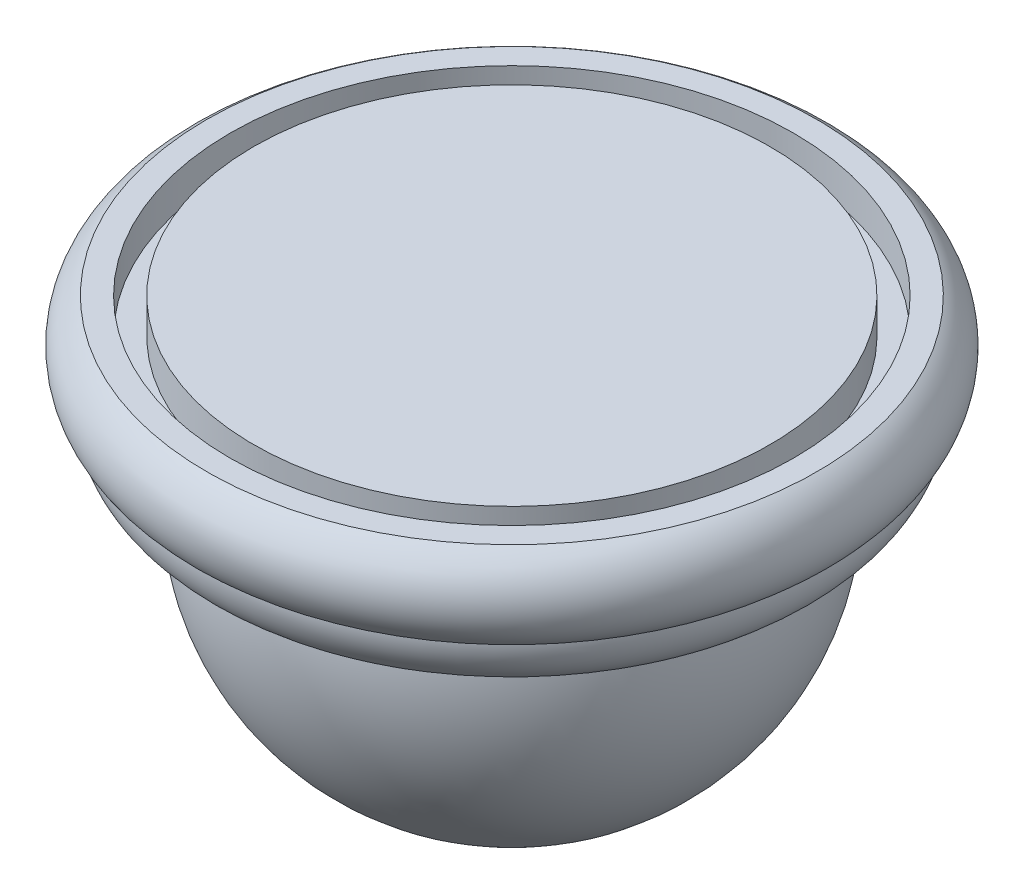
ISO-10303-21;
HEADER;
FILE_DESCRIPTION(('STEP AP214'),'2;1');
FILE_NAME('part.step','',(''),(''),'','','');
FILE_SCHEMA(('AUTOMOTIVE_DESIGN { 1 0 10303 214 1 1 1 1 }'));
ENDSEC;
DATA;
#1=APPLICATION_CONTEXT('core data for automotive mechanical design processes');
#2=APPLICATION_PROTOCOL_DEFINITION('international standard','automotive_design',2000,#1);
#3=PRODUCT_CONTEXT('',#1,'mechanical');
#4=PRODUCT('Part','Part','',(#3));
#5=PRODUCT_RELATED_PRODUCT_CATEGORY('part','',(#4));
#6=PRODUCT_DEFINITION_FORMATION('','',#4);
#7=PRODUCT_DEFINITION_CONTEXT('part definition',#1,'design');
#8=PRODUCT_DEFINITION('design','',#6,#7);
#9=PRODUCT_DEFINITION_SHAPE('','',#8);
#10=(LENGTH_UNIT() NAMED_UNIT(*) SI_UNIT(.MILLI.,.METRE.));
#11=(NAMED_UNIT(*) PLANE_ANGLE_UNIT() SI_UNIT($,.RADIAN.));
#12=(NAMED_UNIT(*) SI_UNIT($,.STERADIAN.) SOLID_ANGLE_UNIT());
#13=UNCERTAINTY_MEASURE_WITH_UNIT(LENGTH_MEASURE(1.E-05),#10,'distance_accuracy_value','');
#14=(GEOMETRIC_REPRESENTATION_CONTEXT(3) GLOBAL_UNCERTAINTY_ASSIGNED_CONTEXT((#13)) GLOBAL_UNIT_ASSIGNED_CONTEXT((#10,
#11,#12)) REPRESENTATION_CONTEXT('',''));
#15=CARTESIAN_POINT('',(0.,0.,0.));
#16=DIRECTION('',(0.,0.,1.));
#17=DIRECTION('',(1.,0.,0.));
#18=AXIS2_PLACEMENT_3D('',#15,#16,#17);
#19=CARTESIAN_POINT('',(0.,-10.8932151769971,0.));
#20=DIRECTION('',(0.,1.,0.));
#21=DIRECTION('',(1.,0.,0.));
#22=AXIS2_PLACEMENT_3D('',#19,#20,#21);
#23=SPHERICAL_SURFACE('',#22,33.5567848230029);
#24=CARTESIAN_POINT('',(0.,-5.19400686490966,0.));
#25=DIRECTION('',(0.,1.,0.));
#26=DIRECTION('',(-1.,0.,0.));
#27=AXIS2_PLACEMENT_3D('',#24,#25,#26);
#28=CIRCLE('',#27,33.0692732347228);
#29=CARTESIAN_POINT('',(-33.0692732347228,-5.19400686490966,0.));
#30=VERTEX_POINT('',#29);
#31=EDGE_CURVE('E10',#30,#30,#28,.T.);
#32=ORIENTED_EDGE('',*,*,#31,.F.);
#33=EDGE_LOOP('',(#32));
#34=FACE_BOUND('',#33,.T.);
#35=ADVANCED_FACE('F41',(#34),#23,.T.);
#36=CARTESIAN_POINT('',(0.,1.27512222572111,0.));
#37=DIRECTION('',(0.,1.,0.));
#38=DIRECTION('',(-1.,0.,0.));
#39=AXIS2_PLACEMENT_3D('',#36,#37,#38);
#40=TOROIDAL_SURFACE('',#39,35.222476461101,6.81805803182481);
#41=CARTESIAN_POINT('',(0.,1.52253499013513,0.));
#42=DIRECTION('',(0.,1.,0.));
#43=DIRECTION('',(-1.,0.,0.));
#44=AXIS2_PLACEMENT_3D('',#41,#42,#43);
#45=CIRCLE('',#44,42.0360439737434);
#46=CARTESIAN_POINT('',(-42.0360439737434,1.52253499013512,0.));
#47=VERTEX_POINT('',#46);
#48=EDGE_CURVE('E48',#47,#47,#45,.T.);
#49=ORIENTED_EDGE('',*,*,#48,.F.);
#50=EDGE_LOOP('',(#49));
#51=FACE_BOUND('',#50,.T.);
#52=ORIENTED_EDGE('',*,*,#31,.T.);
#53=EDGE_LOOP('',(#52));
#54=FACE_BOUND('',#53,.T.);
#55=ADVANCED_FACE('F105',(#51,#54),#40,.T.);
#56=CARTESIAN_POINT('',(0.,6.84723711812244,0.));
#57=DIRECTION('',(0.,1.,0.));
#58=DIRECTION('',(-1.,0.,0.));
#59=AXIS2_PLACEMENT_3D('',#56,#57,#58);
#60=TOROIDAL_SURFACE('',#59,37.7777036193872,6.81805803182482);
#61=CARTESIAN_POINT('',(0.,12.7,0.));
#62=DIRECTION('',(0.,1.,0.));
#63=DIRECTION('',(-1.,0.,0.));
#64=AXIS2_PLACEMENT_3D('',#61,#62,#63);
#65=CIRCLE('',#64,41.275);
#66=CARTESIAN_POINT('',(-41.275,12.7,0.));
#67=VERTEX_POINT('',#66);
#68=EDGE_CURVE('E53',#67,#67,#65,.T.);
#69=ORIENTED_EDGE('',*,*,#68,.F.);
#70=EDGE_LOOP('',(#69));
#71=FACE_BOUND('',#70,.T.);
#72=ORIENTED_EDGE('',*,*,#48,.T.);
#73=EDGE_LOOP('',(#72));
#74=FACE_BOUND('',#73,.T.);
#75=ADVANCED_FACE('F100',(#71,#74),#60,.T.);
#76=CARTESIAN_POINT('',(38.1,12.7,0.));
#77=DIRECTION('',(0.,-1.,0.));
#78=DIRECTION('',(1.,0.,0.));
#79=AXIS2_PLACEMENT_3D('',#76,#77,#78);
#80=PLANE('',#79);
#81=CARTESIAN_POINT('',(0.,12.7,0.));
#82=DIRECTION('',(0.,1.,0.));
#83=DIRECTION('',(-1.,0.,0.));
#84=AXIS2_PLACEMENT_3D('',#81,#82,#83);
#85=CIRCLE('',#84,38.1);
#86=CARTESIAN_POINT('',(-38.1,12.7,0.));
#87=VERTEX_POINT('',#86);
#88=EDGE_CURVE('E58',#87,#87,#85,.T.);
#89=ORIENTED_EDGE('',*,*,#88,.F.);
#90=EDGE_LOOP('',(#89));
#91=FACE_BOUND('',#90,.T.);
#92=ORIENTED_EDGE('',*,*,#68,.T.);
#93=EDGE_LOOP('',(#92));
#94=FACE_BOUND('',#93,.T.);
#95=ADVANCED_FACE('F94',(#91,#94),#80,.F.);
#96=CARTESIAN_POINT('',(0.,12.7,0.));
#97=DIRECTION('',(0.,1.,0.));
#98=DIRECTION('',(-1.,0.,0.));
#99=AXIS2_PLACEMENT_3D('',#96,#97,#98);
#100=CYLINDRICAL_SURFACE('',#99,38.1);
#101=CARTESIAN_POINT('',(0.,7.9375,0.));
#102=DIRECTION('',(0.,1.,0.));
#103=DIRECTION('',(-1.,0.,0.));
#104=AXIS2_PLACEMENT_3D('',#101,#102,#103);
#105=CIRCLE('',#104,38.1);
#106=CARTESIAN_POINT('',(-38.1,7.93749999999999,0.));
#107=VERTEX_POINT('',#106);
#108=EDGE_CURVE('E64',#107,#107,#105,.T.);
#109=ORIENTED_EDGE('',*,*,#108,.F.);
#110=EDGE_LOOP('',(#109));
#111=FACE_BOUND('',#110,.T.);
#112=ORIENTED_EDGE('',*,*,#88,.T.);
#113=EDGE_LOOP('',(#112));
#114=FACE_BOUND('',#113,.T.);
#115=ADVANCED_FACE('F88',(#111,#114),#100,.F.);
#116=CARTESIAN_POINT('',(38.1,7.9375,0.));
#117=DIRECTION('',(0.,-1.,0.));
#118=DIRECTION('',(1.,0.,0.));
#119=AXIS2_PLACEMENT_3D('',#116,#117,#118);
#120=PLANE('',#119);
#121=CARTESIAN_POINT('',(0.,7.9375,0.));
#122=DIRECTION('',(0.,1.,0.));
#123=DIRECTION('',(-1.,0.,0.));
#124=AXIS2_PLACEMENT_3D('',#121,#122,#123);
#125=CIRCLE('',#124,34.925);
#126=CARTESIAN_POINT('',(-34.925,7.93749999999999,0.));
#127=VERTEX_POINT('',#126);
#128=EDGE_CURVE('E68',#127,#127,#125,.T.);
#129=ORIENTED_EDGE('',*,*,#128,.F.);
#130=EDGE_LOOP('',(#129));
#131=FACE_BOUND('',#130,.T.);
#132=ORIENTED_EDGE('',*,*,#108,.T.);
#133=EDGE_LOOP('',(#132));
#134=FACE_BOUND('',#133,.T.);
#135=ADVANCED_FACE('F82',(#131,#134),#120,.F.);
#136=CARTESIAN_POINT('',(0.,12.7,0.));
#137=DIRECTION('',(0.,1.,0.));
#138=DIRECTION('',(-1.,0.,0.));
#139=AXIS2_PLACEMENT_3D('',#136,#137,#138);
#140=CYLINDRICAL_SURFACE('',#139,34.925);
#141=CARTESIAN_POINT('',(0.,12.7,0.));
#142=DIRECTION('',(0.,1.,0.));
#143=DIRECTION('',(-1.,0.,0.));
#144=AXIS2_PLACEMENT_3D('',#141,#142,#143);
#145=CIRCLE('',#144,34.925);
#146=CARTESIAN_POINT('',(-34.925,12.7,0.));
#147=VERTEX_POINT('',#146);
#148=EDGE_CURVE('E72',#147,#147,#145,.T.);
#149=ORIENTED_EDGE('',*,*,#148,.F.);
#150=EDGE_LOOP('',(#149));
#151=FACE_BOUND('',#150,.T.);
#152=ORIENTED_EDGE('',*,*,#128,.T.);
#153=EDGE_LOOP('',(#152));
#154=FACE_BOUND('',#153,.T.);
#155=ADVANCED_FACE('F79',(#151,#154),#140,.T.);
#156=CARTESIAN_POINT('',(34.925,12.7,0.));
#157=DIRECTION('',(0.,-1.,0.));
#158=DIRECTION('',(1.,0.,0.));
#159=AXIS2_PLACEMENT_3D('',#156,#157,#158);
#160=PLANE('',#159);
#161=ORIENTED_EDGE('',*,*,#148,.T.);
#162=EDGE_LOOP('',(#161));
#163=FACE_BOUND('',#162,.T.);
#164=ADVANCED_FACE('F77',(#163),#160,.F.);
#165=CLOSED_SHELL('',(#35,#55,#75,#95,#115,#135,#155,#164));
#166=MANIFOLD_SOLID_BREP('B2',#165);
#167=ADVANCED_BREP_SHAPE_REPRESENTATION('',(#18,#166),#14);
#168=SHAPE_DEFINITION_REPRESENTATION(#9,#167);
ENDSEC;
END-ISO-10303-21;
